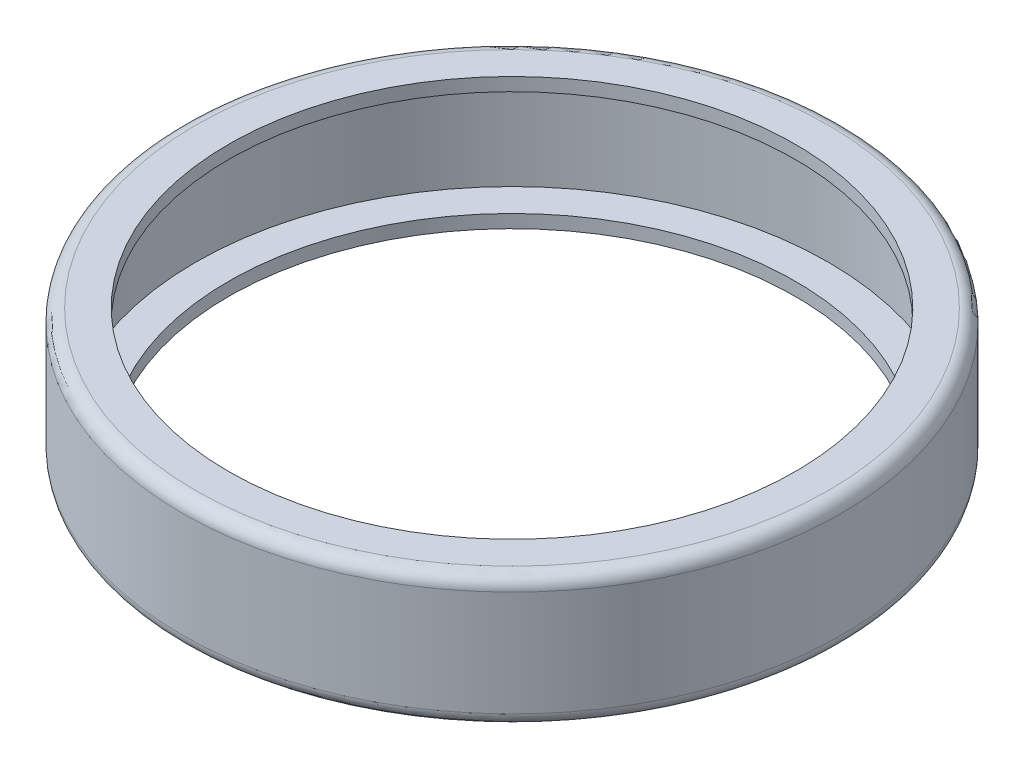
ISO-10303-21;
HEADER;
FILE_DESCRIPTION(('STEP AP214'),'2;1');
FILE_NAME('part.step','',(''),(''),'','','');
FILE_SCHEMA(('AUTOMOTIVE_DESIGN { 1 0 10303 214 1 1 1 1 }'));
ENDSEC;
DATA;
#1=APPLICATION_CONTEXT('core data for automotive mechanical design processes');
#2=APPLICATION_PROTOCOL_DEFINITION('international standard','automotive_design',2000,#1);
#3=PRODUCT_CONTEXT('',#1,'mechanical');
#4=PRODUCT('Part','Part','',(#3));
#5=PRODUCT_RELATED_PRODUCT_CATEGORY('part','',(#4));
#6=PRODUCT_DEFINITION_FORMATION('','',#4);
#7=PRODUCT_DEFINITION_CONTEXT('part definition',#1,'design');
#8=PRODUCT_DEFINITION('design','',#6,#7);
#9=PRODUCT_DEFINITION_SHAPE('','',#8);
#10=(LENGTH_UNIT() NAMED_UNIT(*) SI_UNIT(.MILLI.,.METRE.));
#11=(NAMED_UNIT(*) PLANE_ANGLE_UNIT() SI_UNIT($,.RADIAN.));
#12=(NAMED_UNIT(*) SI_UNIT($,.STERADIAN.) SOLID_ANGLE_UNIT());
#13=UNCERTAINTY_MEASURE_WITH_UNIT(LENGTH_MEASURE(1.E-05),#10,'distance_accuracy_value','');
#14=(GEOMETRIC_REPRESENTATION_CONTEXT(3) GLOBAL_UNCERTAINTY_ASSIGNED_CONTEXT((#13)) GLOBAL_UNIT_ASSIGNED_CONTEXT((#10,
#11,#12)) REPRESENTATION_CONTEXT('',''));
#15=CARTESIAN_POINT('',(0.,0.,0.));
#16=DIRECTION('',(0.,0.,1.));
#17=DIRECTION('',(1.,0.,0.));
#18=AXIS2_PLACEMENT_3D('',#15,#16,#17);
#19=CARTESIAN_POINT('',(0.,9.08512374127273,0.));
#20=DIRECTION('',(0.,1.,0.));
#21=DIRECTION('',(0.,0.,1.));
#22=AXIS2_PLACEMENT_3D('',#19,#20,#21);
#23=CYLINDRICAL_SURFACE('',#22,24.);
#24=CARTESIAN_POINT('',(0.,9.,0.));
#25=DIRECTION('',(0.,1.,0.));
#26=DIRECTION('',(0.,0.,1.));
#27=AXIS2_PLACEMENT_3D('',#24,#25,#26);
#28=CIRCLE('',#27,24.);
#29=CARTESIAN_POINT('',(0.,9.,24.));
#30=VERTEX_POINT('',#29);
#31=EDGE_CURVE('E61',#30,#30,#28,.T.);
#32=ORIENTED_EDGE('',*,*,#31,.T.);
#33=EDGE_LOOP('',(#32));
#34=FACE_BOUND('',#33,.T.);
#35=CARTESIAN_POINT('',(0.,0.999999999999999,0.));
#36=DIRECTION('',(0.,1.,0.));
#37=DIRECTION('',(0.,0.,1.));
#38=AXIS2_PLACEMENT_3D('',#35,#36,#37);
#39=CIRCLE('',#38,24.);
#40=CARTESIAN_POINT('',(0.,0.999999999999999,24.));
#41=VERTEX_POINT('',#40);
#42=EDGE_CURVE('E81',#41,#41,#39,.T.);
#43=ORIENTED_EDGE('',*,*,#42,.F.);
#44=EDGE_LOOP('',(#43));
#45=FACE_BOUND('',#44,.T.);
#46=ADVANCED_FACE('F37',(#34,#45),#23,.F.);
#47=CARTESIAN_POINT('',(-21.5,9.,0.));
#48=DIRECTION('',(0.,-1.,0.));
#49=DIRECTION('',(0.,0.,-1.));
#50=AXIS2_PLACEMENT_3D('',#47,#48,#49);
#51=PLANE('',#50);
#52=CARTESIAN_POINT('',(0.,9.,0.));
#53=DIRECTION('',(0.,1.,0.));
#54=DIRECTION('',(0.,0.,1.));
#55=AXIS2_PLACEMENT_3D('',#52,#53,#54);
#56=CIRCLE('',#55,21.5);
#57=CARTESIAN_POINT('',(0.,9.,21.5));
#58=VERTEX_POINT('',#57);
#59=EDGE_CURVE('E65',#58,#58,#56,.T.);
#60=ORIENTED_EDGE('',*,*,#59,.T.);
#61=EDGE_LOOP('',(#60));
#62=FACE_BOUND('',#61,.T.);
#63=ORIENTED_EDGE('',*,*,#31,.F.);
#64=EDGE_LOOP('',(#63));
#65=FACE_BOUND('',#64,.T.);
#66=ADVANCED_FACE('F90',(#62,#65),#51,.T.);
#67=CARTESIAN_POINT('',(0.,9.08512374127273,0.));
#68=DIRECTION('',(0.,1.,0.));
#69=DIRECTION('',(0.,0.,1.));
#70=AXIS2_PLACEMENT_3D('',#67,#68,#69);
#71=CYLINDRICAL_SURFACE('',#70,21.5);
#72=CARTESIAN_POINT('',(0.,10.,0.));
#73=DIRECTION('',(0.,1.,0.));
#74=DIRECTION('',(0.,0.,1.));
#75=AXIS2_PLACEMENT_3D('',#72,#73,#74);
#76=CIRCLE('',#75,21.5);
#77=CARTESIAN_POINT('',(0.,10.,21.5));
#78=VERTEX_POINT('',#77);
#79=EDGE_CURVE('E69',#78,#78,#76,.T.);
#80=ORIENTED_EDGE('',*,*,#79,.T.);
#81=EDGE_LOOP('',(#80));
#82=FACE_BOUND('',#81,.T.);
#83=ORIENTED_EDGE('',*,*,#59,.F.);
#84=EDGE_LOOP('',(#83));
#85=FACE_BOUND('',#84,.T.);
#86=ADVANCED_FACE('F96',(#82,#85),#71,.F.);
#87=CARTESIAN_POINT('',(-25.,10.,0.));
#88=DIRECTION('',(0.,1.,0.));
#89=DIRECTION('',(0.,0.,1.));
#90=AXIS2_PLACEMENT_3D('',#87,#88,#89);
#91=PLANE('',#90);
#92=CARTESIAN_POINT('',(0.,10.,0.));
#93=DIRECTION('',(0.,1.,0.));
#94=DIRECTION('',(0.,0.,1.));
#95=AXIS2_PLACEMENT_3D('',#92,#93,#94);
#96=CIRCLE('',#95,24.);
#97=CARTESIAN_POINT('',(0.,10.,24.));
#98=VERTEX_POINT('',#97);
#99=EDGE_CURVE('E10',#98,#98,#96,.T.);
#100=ORIENTED_EDGE('',*,*,#99,.T.);
#101=EDGE_LOOP('',(#100));
#102=FACE_BOUND('',#101,.T.);
#103=ORIENTED_EDGE('',*,*,#79,.F.);
#104=EDGE_LOOP('',(#103));
#105=FACE_BOUND('',#104,.T.);
#106=ADVANCED_FACE('F117',(#102,#105),#91,.T.);
#107=CARTESIAN_POINT('',(0.,9.08512374127273,0.));
#108=DIRECTION('',(0.,1.,0.));
#109=DIRECTION('',(0.,0.,1.));
#110=AXIS2_PLACEMENT_3D('',#107,#108,#109);
#111=CYLINDRICAL_SURFACE('',#110,25.);
#112=CARTESIAN_POINT('',(0.,0.999999999999999,0.));
#113=DIRECTION('',(0.,-1.,0.));
#114=DIRECTION('',(0.,0.,-1.));
#115=AXIS2_PLACEMENT_3D('',#112,#113,#114);
#116=CIRCLE('',#115,25.);
#117=CARTESIAN_POINT('',(0.,0.999999999999999,-25.));
#118=VERTEX_POINT('',#117);
#119=EDGE_CURVE('E50',#118,#118,#116,.F.);
#120=ORIENTED_EDGE('',*,*,#119,.T.);
#121=EDGE_LOOP('',(#120));
#122=FACE_BOUND('',#121,.T.);
#123=CARTESIAN_POINT('',(0.,9.,0.));
#124=DIRECTION('',(0.,1.,0.));
#125=DIRECTION('',(0.,0.,1.));
#126=AXIS2_PLACEMENT_3D('',#123,#124,#125);
#127=CIRCLE('',#126,25.);
#128=CARTESIAN_POINT('',(0.,9.,25.));
#129=VERTEX_POINT('',#128);
#130=EDGE_CURVE('E55',#129,#129,#127,.F.);
#131=ORIENTED_EDGE('',*,*,#130,.T.);
#132=EDGE_LOOP('',(#131));
#133=FACE_BOUND('',#132,.T.);
#134=ADVANCED_FACE('F113',(#122,#133),#111,.T.);
#135=CARTESIAN_POINT('',(-21.5,0.,0.));
#136=DIRECTION('',(0.,-1.,0.));
#137=DIRECTION('',(0.,0.,-1.));
#138=AXIS2_PLACEMENT_3D('',#135,#136,#137);
#139=PLANE('',#138);
#140=CARTESIAN_POINT('',(0.,0.,0.));
#141=DIRECTION('',(0.,-1.,0.));
#142=DIRECTION('',(0.,0.,-1.));
#143=AXIS2_PLACEMENT_3D('',#140,#141,#142);
#144=CIRCLE('',#143,24.);
#145=CARTESIAN_POINT('',(0.,0.,-24.));
#146=VERTEX_POINT('',#145);
#147=EDGE_CURVE('E45',#146,#146,#144,.T.);
#148=ORIENTED_EDGE('',*,*,#147,.T.);
#149=EDGE_LOOP('',(#148));
#150=FACE_BOUND('',#149,.T.);
#151=CARTESIAN_POINT('',(0.,0.,0.));
#152=DIRECTION('',(0.,1.,0.));
#153=DIRECTION('',(0.,0.,1.));
#154=AXIS2_PLACEMENT_3D('',#151,#152,#153);
#155=CIRCLE('',#154,21.5);
#156=CARTESIAN_POINT('',(0.,0.,21.5));
#157=VERTEX_POINT('',#156);
#158=EDGE_CURVE('E73',#157,#157,#155,.T.);
#159=ORIENTED_EDGE('',*,*,#158,.T.);
#160=EDGE_LOOP('',(#159));
#161=FACE_BOUND('',#160,.T.);
#162=ADVANCED_FACE('F116',(#150,#161),#139,.T.);
#163=CARTESIAN_POINT('',(0.,9.08512374127273,0.));
#164=DIRECTION('',(0.,1.,0.));
#165=DIRECTION('',(0.,0.,1.));
#166=AXIS2_PLACEMENT_3D('',#163,#164,#165);
#167=CYLINDRICAL_SURFACE('',#166,21.5);
#168=CARTESIAN_POINT('',(0.,0.999999999999999,0.));
#169=DIRECTION('',(0.,1.,0.));
#170=DIRECTION('',(0.,0.,1.));
#171=AXIS2_PLACEMENT_3D('',#168,#169,#170);
#172=CIRCLE('',#171,21.5);
#173=CARTESIAN_POINT('',(0.,0.999999999999999,21.5));
#174=VERTEX_POINT('',#173);
#175=EDGE_CURVE('E77',#174,#174,#172,.T.);
#176=ORIENTED_EDGE('',*,*,#175,.T.);
#177=EDGE_LOOP('',(#176));
#178=FACE_BOUND('',#177,.T.);
#179=ORIENTED_EDGE('',*,*,#158,.F.);
#180=EDGE_LOOP('',(#179));
#181=FACE_BOUND('',#180,.T.);
#182=ADVANCED_FACE('F108',(#178,#181),#167,.F.);
#183=CARTESIAN_POINT('',(-24.,1.,0.));
#184=DIRECTION('',(0.,1.,0.));
#185=DIRECTION('',(0.,0.,1.));
#186=AXIS2_PLACEMENT_3D('',#183,#184,#185);
#187=PLANE('',#186);
#188=ORIENTED_EDGE('',*,*,#42,.T.);
#189=EDGE_LOOP('',(#188));
#190=FACE_BOUND('',#189,.T.);
#191=ORIENTED_EDGE('',*,*,#175,.F.);
#192=EDGE_LOOP('',(#191));
#193=FACE_BOUND('',#192,.T.);
#194=ADVANCED_FACE('F86',(#190,#193),#187,.T.);
#195=CARTESIAN_POINT('',(0.,0.999999999999999,0.));
#196=DIRECTION('',(0.,-1.,0.));
#197=DIRECTION('',(0.,0.,-1.));
#198=AXIS2_PLACEMENT_3D('',#195,#196,#197);
#199=TOROIDAL_SURFACE('',#198,24.,1.);
#200=ORIENTED_EDGE('',*,*,#147,.F.);
#201=EDGE_LOOP('',(#200));
#202=FACE_BOUND('',#201,.T.);
#203=ORIENTED_EDGE('',*,*,#119,.F.);
#204=EDGE_LOOP('',(#203));
#205=FACE_BOUND('',#204,.T.);
#206=ADVANCED_FACE('F100',(#202,#205),#199,.T.);
#207=CARTESIAN_POINT('',(0.,9.,0.));
#208=DIRECTION('',(0.,1.,0.));
#209=DIRECTION('',(0.,0.,1.));
#210=AXIS2_PLACEMENT_3D('',#207,#208,#209);
#211=TOROIDAL_SURFACE('',#210,24.,1.);
#212=ORIENTED_EDGE('',*,*,#130,.F.);
#213=EDGE_LOOP('',(#212));
#214=FACE_BOUND('',#213,.T.);
#215=ORIENTED_EDGE('',*,*,#99,.F.);
#216=EDGE_LOOP('',(#215));
#217=FACE_BOUND('',#216,.T.);
#218=ADVANCED_FACE('F39',(#214,#217),#211,.T.);
#219=CLOSED_SHELL('',(#46,#66,#86,#106,#134,#162,#182,#194,#206,#218));
#220=MANIFOLD_SOLID_BREP('B2',#219);
#221=ADVANCED_BREP_SHAPE_REPRESENTATION('',(#18,#220),#14);
#222=SHAPE_DEFINITION_REPRESENTATION(#9,#221);
ENDSEC;
END-ISO-10303-21;
